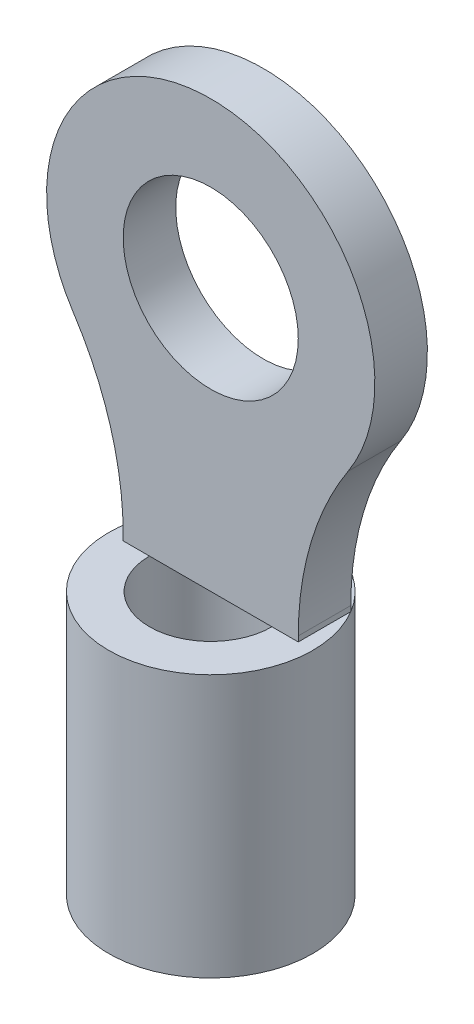
ISO-10303-21;
HEADER;
FILE_DESCRIPTION(('STEP AP214'),'2;1');
FILE_NAME('part.step','',(''),(''),'','','');
FILE_SCHEMA(('AUTOMOTIVE_DESIGN { 1 0 10303 214 1 1 1 1 }'));
ENDSEC;
DATA;
#1=APPLICATION_CONTEXT('core data for automotive mechanical design processes');
#2=APPLICATION_PROTOCOL_DEFINITION('international standard','automotive_design',2000,#1);
#3=PRODUCT_CONTEXT('',#1,'mechanical');
#4=PRODUCT('Part','Part','',(#3));
#5=PRODUCT_RELATED_PRODUCT_CATEGORY('part','',(#4));
#6=PRODUCT_DEFINITION_FORMATION('','',#4);
#7=PRODUCT_DEFINITION_CONTEXT('part definition',#1,'design');
#8=PRODUCT_DEFINITION('design','',#6,#7);
#9=PRODUCT_DEFINITION_SHAPE('','',#8);
#10=(LENGTH_UNIT() NAMED_UNIT(*) SI_UNIT(.MILLI.,.METRE.));
#11=(NAMED_UNIT(*) PLANE_ANGLE_UNIT() SI_UNIT($,.RADIAN.));
#12=(NAMED_UNIT(*) SI_UNIT($,.STERADIAN.) SOLID_ANGLE_UNIT());
#13=UNCERTAINTY_MEASURE_WITH_UNIT(LENGTH_MEASURE(1.E-05),#10,'distance_accuracy_value','');
#14=(GEOMETRIC_REPRESENTATION_CONTEXT(3) GLOBAL_UNCERTAINTY_ASSIGNED_CONTEXT((#13)) GLOBAL_UNIT_ASSIGNED_CONTEXT((#10,
#11,#12)) REPRESENTATION_CONTEXT('',''));
#15=CARTESIAN_POINT('',(0.,0.,0.));
#16=DIRECTION('',(0.,0.,1.));
#17=DIRECTION('',(1.,0.,0.));
#18=AXIS2_PLACEMENT_3D('',#15,#16,#17);
#19=CARTESIAN_POINT('',(-0.5,-1.5,0.3));
#20=DIRECTION('',(0.,1.,0.));
#21=DIRECTION('',(-1.,0.,0.));
#22=AXIS2_PLACEMENT_3D('',#19,#20,#21);
#23=PLANE('',#22);
#24=DIRECTION('',(1.,0.,0.));
#25=VECTOR('',#24,1.);
#26=CARTESIAN_POINT('',(-0.5,-1.5,0.3));
#27=LINE('',#26,#25);
#28=CARTESIAN_POINT('',(-0.35,-1.5,0.3));
#29=VERTEX_POINT('',#28);
#30=CARTESIAN_POINT('',(0.35,-1.5,0.3));
#31=VERTEX_POINT('',#30);
#32=EDGE_CURVE('E171',#29,#31,#27,.T.);
#33=ORIENTED_EDGE('',*,*,#32,.F.);
#34=CARTESIAN_POINT('',(0.,-1.5,0.3));
#35=DIRECTION('',(0.,-1.,0.));
#36=DIRECTION('',(1.,0.,0.));
#37=AXIS2_PLACEMENT_3D('',#34,#35,#36);
#38=CIRCLE('',#37,0.35);
#39=CARTESIAN_POINT('',(-0.180277563773199,-1.5,0.));
#40=VERTEX_POINT('',#39);
#41=EDGE_CURVE('E11',#29,#40,#38,.T.);
#42=ORIENTED_EDGE('',*,*,#41,.T.);
#43=DIRECTION('',(1.,0.,0.));
#44=VECTOR('',#43,1.);
#45=CARTESIAN_POINT('',(-0.5,-1.5,0.));
#46=LINE('',#45,#44);
#47=CARTESIAN_POINT('',(0.1802775637732,-1.5,0.));
#48=VERTEX_POINT('',#47);
#49=EDGE_CURVE('E142',#40,#48,#46,.T.);
#50=ORIENTED_EDGE('',*,*,#49,.T.);
#51=EDGE_CURVE('E43',#48,#31,#38,.T.);
#52=ORIENTED_EDGE('',*,*,#51,.T.);
#53=EDGE_LOOP('',(#33,#42,#50,#52));
#54=FACE_BOUND('',#53,.T.);
#55=ADVANCED_FACE('F34',(#54),#23,.F.);
#56=CARTESIAN_POINT('',(2.25,-1.46974700203811,0.3));
#57=DIRECTION('',(0.,0.,-1.));
#58=DIRECTION('',(-1.,0.,0.));
#59=AXIS2_PLACEMENT_3D('',#56,#57,#58);
#60=PLANE('',#59);
#61=CARTESIAN_POINT('',(2.25,-1.46974700203811,0.3));
#62=DIRECTION('',(0.,0.,-1.));
#63=DIRECTION('',(-1.,0.,0.));
#64=AXIS2_PLACEMENT_3D('',#61,#62,#63);
#65=CIRCLE('',#64,1.75);
#66=CARTESIAN_POINT('',(0.5,-1.46974700203811,0.3));
#67=VERTEX_POINT('',#66);
#68=CARTESIAN_POINT('',(0.784883720930233,-0.512702442571432,0.3));
#69=VERTEX_POINT('',#68);
#70=EDGE_CURVE('E145',#67,#69,#65,.T.);
#71=ORIENTED_EDGE('',*,*,#70,.T.);
#72=CARTESIAN_POINT('',(0.,0.,0.3));
#73=DIRECTION('',(0.,0.,1.));
#74=DIRECTION('',(1.,0.,0.));
#75=AXIS2_PLACEMENT_3D('',#72,#73,#74);
#76=CIRCLE('',#75,0.9375);
#77=CARTESIAN_POINT('',(-0.784883720930233,-0.512702442571433,0.3));
#78=VERTEX_POINT('',#77);
#79=EDGE_CURVE('E218',#69,#78,#76,.T.);
#80=ORIENTED_EDGE('',*,*,#79,.T.);
#81=CARTESIAN_POINT('',(-2.25,-1.46974700203811,0.3));
#82=DIRECTION('',(0.,0.,-1.));
#83=DIRECTION('',(1.,0.,0.));
#84=AXIS2_PLACEMENT_3D('',#81,#82,#83);
#85=CIRCLE('',#84,1.75);
#86=CARTESIAN_POINT('',(-0.5,-1.46974700203811,0.3));
#87=VERTEX_POINT('',#86);
#88=EDGE_CURVE('E216',#78,#87,#85,.T.);
#89=ORIENTED_EDGE('',*,*,#88,.T.);
#90=DIRECTION('',(0.,-1.,0.));
#91=VECTOR('',#90,1.);
#92=CARTESIAN_POINT('',(-0.5,-1.46974700203811,0.3));
#93=LINE('',#92,#91);
#94=CARTESIAN_POINT('',(-0.5,-1.5,0.3));
#95=VERTEX_POINT('',#94);
#96=EDGE_CURVE('E214',#87,#95,#93,.T.);
#97=ORIENTED_EDGE('',*,*,#96,.T.);
#98=EDGE_CURVE('E106',#95,#29,#27,.T.);
#99=ORIENTED_EDGE('',*,*,#98,.T.);
#100=ORIENTED_EDGE('',*,*,#32,.T.);
#101=CARTESIAN_POINT('',(0.5,-1.5,0.3));
#102=VERTEX_POINT('',#101);
#103=EDGE_CURVE('E213',#31,#102,#27,.T.);
#104=ORIENTED_EDGE('',*,*,#103,.T.);
#105=DIRECTION('',(0.,1.,0.));
#106=VECTOR('',#105,1.);
#107=CARTESIAN_POINT('',(0.5,-1.5,0.3));
#108=LINE('',#107,#106);
#109=EDGE_CURVE('E152',#102,#67,#108,.T.);
#110=ORIENTED_EDGE('',*,*,#109,.T.);
#111=EDGE_LOOP('',(#71,#80,#89,#97,#99,#100,#104,#110));
#112=FACE_BOUND('',#111,.T.);
#113=CARTESIAN_POINT('',(0.,0.,0.3));
#114=DIRECTION('',(0.,0.,1.));
#115=DIRECTION('',(1.,0.,0.));
#116=AXIS2_PLACEMENT_3D('',#113,#114,#115);
#117=CIRCLE('',#116,0.5);
#118=CARTESIAN_POINT('',(0.5,0.,0.3));
#119=VERTEX_POINT('',#118);
#120=EDGE_CURVE('E208',#119,#119,#117,.T.);
#121=ORIENTED_EDGE('',*,*,#120,.F.);
#122=EDGE_LOOP('',(#121));
#123=FACE_BOUND('',#122,.T.);
#124=ADVANCED_FACE('F184',(#112,#123),#60,.F.);
#125=CARTESIAN_POINT('',(2.25,-1.46974700203811,0.));
#126=DIRECTION('',(0.,0.,-1.));
#127=DIRECTION('',(-1.,0.,0.));
#128=AXIS2_PLACEMENT_3D('',#125,#126,#127);
#129=PLANE('',#128);
#130=CARTESIAN_POINT('',(2.25,-1.46974700203811,0.));
#131=DIRECTION('',(0.,0.,-1.));
#132=DIRECTION('',(-1.,0.,0.));
#133=AXIS2_PLACEMENT_3D('',#130,#131,#132);
#134=CIRCLE('',#133,1.75);
#135=CARTESIAN_POINT('',(0.5,-1.46974700203811,0.));
#136=VERTEX_POINT('',#135);
#137=CARTESIAN_POINT('',(0.784883720930233,-0.512702442571432,0.));
#138=VERTEX_POINT('',#137);
#139=EDGE_CURVE('E206',#136,#138,#134,.T.);
#140=ORIENTED_EDGE('',*,*,#139,.F.);
#141=DIRECTION('',(0.,1.,0.));
#142=VECTOR('',#141,1.);
#143=CARTESIAN_POINT('',(0.5,-1.5,0.));
#144=LINE('',#143,#142);
#145=CARTESIAN_POINT('',(0.5,-1.5,0.));
#146=VERTEX_POINT('',#145);
#147=EDGE_CURVE('E143',#146,#136,#144,.T.);
#148=ORIENTED_EDGE('',*,*,#147,.F.);
#149=EDGE_CURVE('E126',#48,#146,#46,.T.);
#150=ORIENTED_EDGE('',*,*,#149,.F.);
#151=ORIENTED_EDGE('',*,*,#49,.F.);
#152=CARTESIAN_POINT('',(-0.5,-1.5,0.));
#153=VERTEX_POINT('',#152);
#154=EDGE_CURVE('E124',#153,#40,#46,.T.);
#155=ORIENTED_EDGE('',*,*,#154,.F.);
#156=DIRECTION('',(0.,-1.,0.));
#157=VECTOR('',#156,1.);
#158=CARTESIAN_POINT('',(-0.5,-1.46974700203811,0.));
#159=LINE('',#158,#157);
#160=CARTESIAN_POINT('',(-0.5,-1.46974700203811,0.));
#161=VERTEX_POINT('',#160);
#162=EDGE_CURVE('E130',#161,#153,#159,.T.);
#163=ORIENTED_EDGE('',*,*,#162,.F.);
#164=CARTESIAN_POINT('',(-2.25,-1.46974700203811,0.));
#165=DIRECTION('',(0.,0.,-1.));
#166=DIRECTION('',(1.,0.,0.));
#167=AXIS2_PLACEMENT_3D('',#164,#165,#166);
#168=CIRCLE('',#167,1.75);
#169=CARTESIAN_POINT('',(-0.784883720930233,-0.512702442571433,0.));
#170=VERTEX_POINT('',#169);
#171=EDGE_CURVE('E135',#170,#161,#168,.T.);
#172=ORIENTED_EDGE('',*,*,#171,.F.);
#173=CARTESIAN_POINT('',(0.,0.,0.));
#174=DIRECTION('',(0.,0.,1.));
#175=DIRECTION('',(1.,0.,0.));
#176=AXIS2_PLACEMENT_3D('',#173,#174,#175);
#177=CIRCLE('',#176,0.9375);
#178=EDGE_CURVE('E205',#138,#170,#177,.T.);
#179=ORIENTED_EDGE('',*,*,#178,.F.);
#180=EDGE_LOOP('',(#140,#148,#150,#151,#155,#163,#172,#179));
#181=FACE_BOUND('',#180,.T.);
#182=CARTESIAN_POINT('',(0.,0.,0.));
#183=DIRECTION('',(0.,0.,1.));
#184=DIRECTION('',(1.,0.,0.));
#185=AXIS2_PLACEMENT_3D('',#182,#183,#184);
#186=CIRCLE('',#185,0.5);
#187=CARTESIAN_POINT('',(0.5,0.,0.));
#188=VERTEX_POINT('',#187);
#189=EDGE_CURVE('E222',#188,#188,#186,.T.);
#190=ORIENTED_EDGE('',*,*,#189,.T.);
#191=EDGE_LOOP('',(#190));
#192=FACE_BOUND('',#191,.T.);
#193=ADVANCED_FACE('F139',(#181,#192),#129,.T.);
#194=CARTESIAN_POINT('',(2.25,-1.46974700203811,0.3));
#195=DIRECTION('',(0.,0.,-1.));
#196=DIRECTION('',(-1.,0.,0.));
#197=AXIS2_PLACEMENT_3D('',#194,#195,#196);
#198=CYLINDRICAL_SURFACE('',#197,1.75);
#199=ORIENTED_EDGE('',*,*,#139,.T.);
#200=DIRECTION('',(0.,0.,-1.));
#201=VECTOR('',#200,1.);
#202=CARTESIAN_POINT('',(0.784883720930233,-0.512702442571432,0.3));
#203=LINE('',#202,#201);
#204=EDGE_CURVE('E38',#69,#138,#203,.T.);
#205=ORIENTED_EDGE('',*,*,#204,.F.);
#206=ORIENTED_EDGE('',*,*,#70,.F.);
#207=DIRECTION('',(0.,0.,-1.));
#208=VECTOR('',#207,1.);
#209=CARTESIAN_POINT('',(0.5,-1.46974700203811,0.3));
#210=LINE('',#209,#208);
#211=EDGE_CURVE('E149',#67,#136,#210,.T.);
#212=ORIENTED_EDGE('',*,*,#211,.T.);
#213=EDGE_LOOP('',(#199,#205,#206,#212));
#214=FACE_BOUND('',#213,.T.);
#215=ADVANCED_FACE('F36',(#214),#198,.F.);
#216=CARTESIAN_POINT('',(0.,0.,0.3));
#217=DIRECTION('',(0.,0.,-1.));
#218=DIRECTION('',(-1.,0.,0.));
#219=AXIS2_PLACEMENT_3D('',#216,#217,#218);
#220=CYLINDRICAL_SURFACE('',#219,0.9375);
#221=ORIENTED_EDGE('',*,*,#178,.T.);
#222=DIRECTION('',(0.,0.,-1.));
#223=VECTOR('',#222,1.);
#224=CARTESIAN_POINT('',(-0.784883720930233,-0.512702442571433,0.3));
#225=LINE('',#224,#223);
#226=EDGE_CURVE('E154',#78,#170,#225,.T.);
#227=ORIENTED_EDGE('',*,*,#226,.F.);
#228=ORIENTED_EDGE('',*,*,#79,.F.);
#229=ORIENTED_EDGE('',*,*,#204,.T.);
#230=EDGE_LOOP('',(#221,#227,#228,#229));
#231=FACE_BOUND('',#230,.T.);
#232=ADVANCED_FACE('F199',(#231),#220,.T.);
#233=CARTESIAN_POINT('',(-2.25,-1.46974700203811,0.3));
#234=DIRECTION('',(0.,0.,-1.));
#235=DIRECTION('',(-1.,0.,0.));
#236=AXIS2_PLACEMENT_3D('',#233,#234,#235);
#237=CYLINDRICAL_SURFACE('',#236,1.75);
#238=ORIENTED_EDGE('',*,*,#171,.T.);
#239=DIRECTION('',(0.,0.,-1.));
#240=VECTOR('',#239,1.);
#241=CARTESIAN_POINT('',(-0.5,-1.46974700203811,0.3));
#242=LINE('',#241,#240);
#243=EDGE_CURVE('E111',#87,#161,#242,.T.);
#244=ORIENTED_EDGE('',*,*,#243,.F.);
#245=ORIENTED_EDGE('',*,*,#88,.F.);
#246=ORIENTED_EDGE('',*,*,#226,.T.);
#247=EDGE_LOOP('',(#238,#244,#245,#246));
#248=FACE_BOUND('',#247,.T.);
#249=ADVANCED_FACE('F197',(#248),#237,.F.);
#250=CARTESIAN_POINT('',(-0.5,-1.46974700203811,0.3));
#251=DIRECTION('',(1.,0.,0.));
#252=DIRECTION('',(0.,0.,-1.));
#253=AXIS2_PLACEMENT_3D('',#250,#251,#252);
#254=PLANE('',#253);
#255=ORIENTED_EDGE('',*,*,#162,.T.);
#256=DIRECTION('',(0.,0.,-1.));
#257=VECTOR('',#256,1.);
#258=CARTESIAN_POINT('',(-0.5,-1.5,0.3));
#259=LINE('',#258,#257);
#260=EDGE_CURVE('E100',#95,#153,#259,.T.);
#261=ORIENTED_EDGE('',*,*,#260,.F.);
#262=ORIENTED_EDGE('',*,*,#96,.F.);
#263=ORIENTED_EDGE('',*,*,#243,.T.);
#264=EDGE_LOOP('',(#255,#261,#262,#263));
#265=FACE_BOUND('',#264,.T.);
#266=ADVANCED_FACE('F131',(#265),#254,.F.);
#267=CARTESIAN_POINT('',(0.5,-1.5,0.3));
#268=DIRECTION('',(-1.,0.,0.));
#269=DIRECTION('',(0.,0.,1.));
#270=AXIS2_PLACEMENT_3D('',#267,#268,#269);
#271=PLANE('',#270);
#272=ORIENTED_EDGE('',*,*,#147,.T.);
#273=ORIENTED_EDGE('',*,*,#211,.F.);
#274=ORIENTED_EDGE('',*,*,#109,.F.);
#275=DIRECTION('',(0.,0.,-1.));
#276=VECTOR('',#275,1.);
#277=CARTESIAN_POINT('',(0.5,-1.5,0.3));
#278=LINE('',#277,#276);
#279=EDGE_CURVE('E112',#102,#146,#278,.T.);
#280=ORIENTED_EDGE('',*,*,#279,.T.);
#281=EDGE_LOOP('',(#272,#273,#274,#280));
#282=FACE_BOUND('',#281,.T.);
#283=ADVANCED_FACE('F193',(#282),#271,.F.);
#284=CARTESIAN_POINT('',(0.,0.,0.3));
#285=DIRECTION('',(0.,0.,-1.));
#286=DIRECTION('',(-1.,0.,0.));
#287=AXIS2_PLACEMENT_3D('',#284,#285,#286);
#288=CYLINDRICAL_SURFACE('',#287,0.5);
#289=ORIENTED_EDGE('',*,*,#120,.T.);
#290=EDGE_LOOP('',(#289));
#291=FACE_BOUND('',#290,.T.);
#292=ORIENTED_EDGE('',*,*,#189,.F.);
#293=EDGE_LOOP('',(#292));
#294=FACE_BOUND('',#293,.T.);
#295=ADVANCED_FACE('F237',(#291,#294),#288,.F.);
#296=CARTESIAN_POINT('',(0.,-1.5,0.3));
#297=DIRECTION('',(0.,-1.,0.));
#298=DIRECTION('',(1.,0.,0.));
#299=AXIS2_PLACEMENT_3D('',#296,#297,#298);
#300=PLANE('',#299);
#301=EDGE_CURVE('E45',#40,#48,#38,.T.);
#302=ORIENTED_EDGE('',*,*,#301,.T.);
#303=ORIENTED_EDGE('',*,*,#149,.T.);
#304=CARTESIAN_POINT('',(0.,-1.5,0.3));
#305=DIRECTION('',(0.,-1.,0.));
#306=DIRECTION('',(1.,0.,0.));
#307=AXIS2_PLACEMENT_3D('',#304,#305,#306);
#308=CIRCLE('',#307,0.58309518948453);
#309=EDGE_CURVE('E117',#153,#146,#308,.T.);
#310=ORIENTED_EDGE('',*,*,#309,.F.);
#311=ORIENTED_EDGE('',*,*,#154,.T.);
#312=EDGE_LOOP('',(#302,#303,#310,#311));
#313=FACE_BOUND('',#312,.T.);
#314=ADVANCED_FACE('F122',(#313),#300,.F.);
#315=ORIENTED_EDGE('',*,*,#279,.F.);
#316=ORIENTED_EDGE('',*,*,#103,.F.);
#317=EDGE_CURVE('E52',#31,#29,#38,.T.);
#318=ORIENTED_EDGE('',*,*,#317,.T.);
#319=ORIENTED_EDGE('',*,*,#98,.F.);
#320=ORIENTED_EDGE('',*,*,#260,.T.);
#321=EDGE_CURVE('E103',#146,#153,#308,.T.);
#322=ORIENTED_EDGE('',*,*,#321,.F.);
#323=EDGE_LOOP('',(#315,#316,#318,#319,#320,#322));
#324=FACE_BOUND('',#323,.T.);
#325=ADVANCED_FACE('F102',(#324),#300,.F.);
#326=CARTESIAN_POINT('',(0.,-3.,0.3));
#327=DIRECTION('',(0.,-1.,0.));
#328=DIRECTION('',(1.,0.,0.));
#329=AXIS2_PLACEMENT_3D('',#326,#327,#328);
#330=PLANE('',#329);
#331=CARTESIAN_POINT('',(0.,-3.,0.3));
#332=DIRECTION('',(0.,-1.,0.));
#333=DIRECTION('',(1.,0.,0.));
#334=AXIS2_PLACEMENT_3D('',#331,#332,#333);
#335=CIRCLE('',#334,0.58309518948453);
#336=CARTESIAN_POINT('',(0.58309518948453,-3.,0.3));
#337=VERTEX_POINT('',#336);
#338=EDGE_CURVE('E127',#337,#337,#335,.T.);
#339=ORIENTED_EDGE('',*,*,#338,.T.);
#340=EDGE_LOOP('',(#339));
#341=FACE_BOUND('',#340,.T.);
#342=CARTESIAN_POINT('',(0.,-3.,0.3));
#343=DIRECTION('',(0.,-1.,0.));
#344=DIRECTION('',(1.,0.,0.));
#345=AXIS2_PLACEMENT_3D('',#342,#343,#344);
#346=CIRCLE('',#345,0.35);
#347=CARTESIAN_POINT('',(0.350000000000001,-3.,0.3));
#348=VERTEX_POINT('',#347);
#349=EDGE_CURVE('E119',#348,#348,#346,.T.);
#350=ORIENTED_EDGE('',*,*,#349,.F.);
#351=EDGE_LOOP('',(#350));
#352=FACE_BOUND('',#351,.T.);
#353=ADVANCED_FACE('F179',(#341,#352),#330,.T.);
#354=CARTESIAN_POINT('',(0.,-3.,0.3));
#355=DIRECTION('',(0.,1.,0.));
#356=DIRECTION('',(-1.,0.,0.));
#357=AXIS2_PLACEMENT_3D('',#354,#355,#356);
#358=CYLINDRICAL_SURFACE('',#357,0.58309518948453);
#359=ORIENTED_EDGE('',*,*,#338,.F.);
#360=EDGE_LOOP('',(#359));
#361=FACE_BOUND('',#360,.T.);
#362=ORIENTED_EDGE('',*,*,#309,.T.);
#363=ORIENTED_EDGE('',*,*,#321,.T.);
#364=EDGE_LOOP('',(#362,#363));
#365=FACE_BOUND('',#364,.T.);
#366=ADVANCED_FACE('F116',(#361,#365),#358,.T.);
#367=CARTESIAN_POINT('',(0.,-3.,0.3));
#368=DIRECTION('',(0.,1.,0.));
#369=DIRECTION('',(-1.,0.,0.));
#370=AXIS2_PLACEMENT_3D('',#367,#368,#369);
#371=CYLINDRICAL_SURFACE('',#370,0.35);
#372=ORIENTED_EDGE('',*,*,#349,.T.);
#373=EDGE_LOOP('',(#372));
#374=FACE_BOUND('',#373,.T.);
#375=ORIENTED_EDGE('',*,*,#317,.F.);
#376=ORIENTED_EDGE('',*,*,#51,.F.);
#377=ORIENTED_EDGE('',*,*,#301,.F.);
#378=ORIENTED_EDGE('',*,*,#41,.F.);
#379=EDGE_LOOP('',(#375,#376,#377,#378));
#380=FACE_BOUND('',#379,.T.);
#381=ADVANCED_FACE('F172',(#374,#380),#371,.F.);
#382=CLOSED_SHELL('',(#55,#124,#193,#215,#232,#249,#266,#283,#295,#314,#325,#353,#366,#381));
#383=MANIFOLD_SOLID_BREP('B2',#382);
#384=ADVANCED_BREP_SHAPE_REPRESENTATION('',(#18,#383),#14);
#385=SHAPE_DEFINITION_REPRESENTATION(#9,#384);
ENDSEC;
END-ISO-10303-21;
